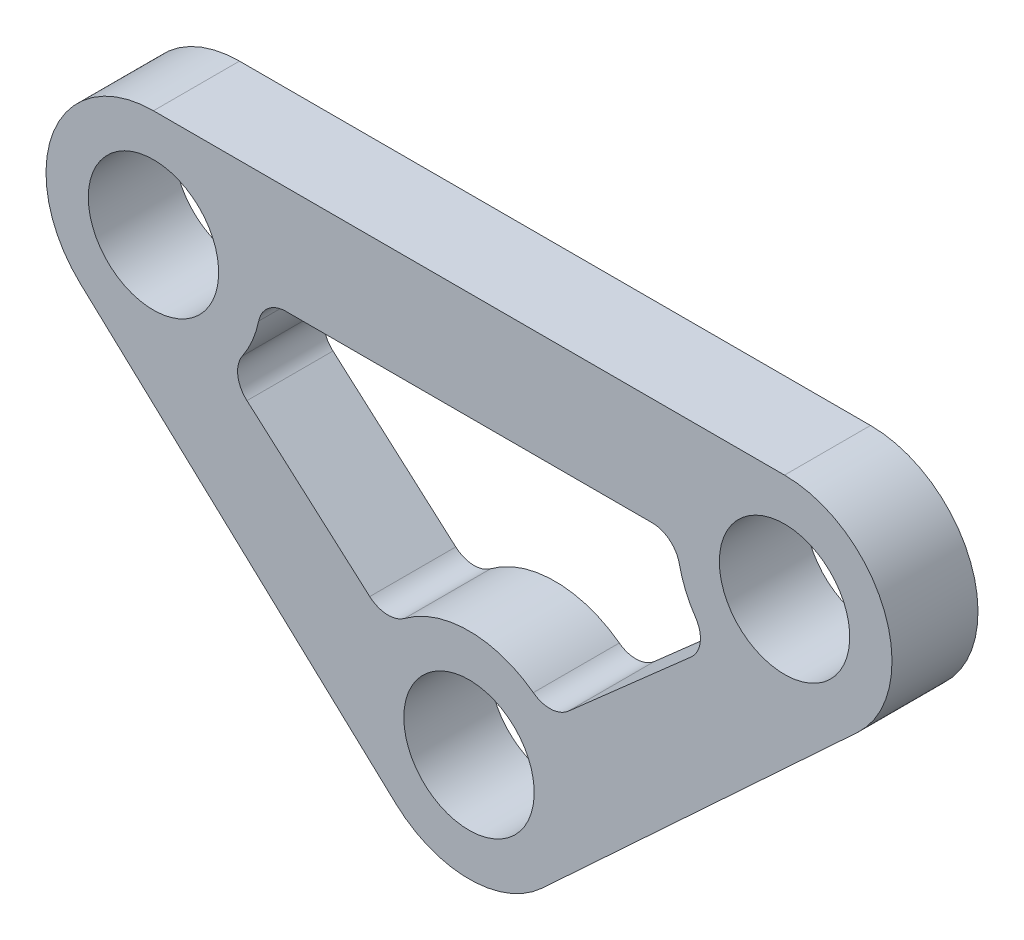
ISO-10303-21;
HEADER;
FILE_DESCRIPTION(('STEP AP214'),'2;1');
FILE_NAME('part.step','',(''),(''),'','','');
FILE_SCHEMA(('AUTOMOTIVE_DESIGN { 1 0 10303 214 1 1 1 1 }'));
ENDSEC;
DATA;
#1=APPLICATION_CONTEXT('core data for automotive mechanical design processes');
#2=APPLICATION_PROTOCOL_DEFINITION('international standard','automotive_design',2000,#1);
#3=PRODUCT_CONTEXT('',#1,'mechanical');
#4=PRODUCT('Part','Part','',(#3));
#5=PRODUCT_RELATED_PRODUCT_CATEGORY('part','',(#4));
#6=PRODUCT_DEFINITION_FORMATION('','',#4);
#7=PRODUCT_DEFINITION_CONTEXT('part definition',#1,'design');
#8=PRODUCT_DEFINITION('design','',#6,#7);
#9=PRODUCT_DEFINITION_SHAPE('','',#8);
#10=(LENGTH_UNIT() NAMED_UNIT(*) SI_UNIT(.MILLI.,.METRE.));
#11=(NAMED_UNIT(*) PLANE_ANGLE_UNIT() SI_UNIT($,.RADIAN.));
#12=(NAMED_UNIT(*) SI_UNIT($,.STERADIAN.) SOLID_ANGLE_UNIT());
#13=UNCERTAINTY_MEASURE_WITH_UNIT(LENGTH_MEASURE(1.E-05),#10,'distance_accuracy_value','');
#14=(GEOMETRIC_REPRESENTATION_CONTEXT(3) GLOBAL_UNCERTAINTY_ASSIGNED_CONTEXT((#13)) GLOBAL_UNIT_ASSIGNED_CONTEXT((#10,
#11,#12)) REPRESENTATION_CONTEXT('',''));
#15=CARTESIAN_POINT('',(0.,0.,0.));
#16=DIRECTION('',(0.,0.,1.));
#17=DIRECTION('',(1.,0.,0.));
#18=AXIS2_PLACEMENT_3D('',#15,#16,#17);
#19=CARTESIAN_POINT('',(-37.1381571139909,26.0584892934717,3.1));
#20=DIRECTION('',(0.,0.,1.));
#21=DIRECTION('',(1.,0.,0.));
#22=AXIS2_PLACEMENT_3D('',#19,#20,#21);
#23=PLANE('',#22);
#24=CARTESIAN_POINT('',(-25.7631571139909,15.5084892934717,3.1));
#25=DIRECTION('',(0.,0.,1.));
#26=DIRECTION('',(-1.,0.,0.));
#27=AXIS2_PLACEMENT_3D('',#24,#25,#26);
#28=CIRCLE('',#27,2.35);
#29=CARTESIAN_POINT('',(-28.1131571139909,15.5084892934717,3.1));
#30=VERTEX_POINT('',#29);
#31=EDGE_CURVE('E249',#30,#30,#28,.T.);
#32=ORIENTED_EDGE('',*,*,#31,.F.);
#33=EDGE_LOOP('',(#32));
#34=FACE_BOUND('',#33,.T.);
#35=CARTESIAN_POINT('',(-14.3881571139909,26.0584892934717,3.1));
#36=DIRECTION('',(0.,0.,1.));
#37=DIRECTION('',(1.,0.,0.));
#38=AXIS2_PLACEMENT_3D('',#35,#36,#37);
#39=CIRCLE('',#38,2.35);
#40=CARTESIAN_POINT('',(-16.7381571139909,26.0584892934717,3.1));
#41=VERTEX_POINT('',#40);
#42=EDGE_CURVE('E261',#41,#41,#39,.T.);
#43=ORIENTED_EDGE('',*,*,#42,.F.);
#44=EDGE_LOOP('',(#43));
#45=FACE_BOUND('',#44,.T.);
#46=CARTESIAN_POINT('',(-37.1381571139909,26.0584892934717,3.1));
#47=DIRECTION('',(0.,0.,1.));
#48=DIRECTION('',(1.,0.,0.));
#49=AXIS2_PLACEMENT_3D('',#46,#47,#48);
#50=CIRCLE('',#49,3.875);
#51=CARTESIAN_POINT('',(-37.1381571139909,29.9334892934717,3.1));
#52=VERTEX_POINT('',#51);
#53=CARTESIAN_POINT('',(-39.7732281276879,23.2173582242013,3.1));
#54=VERTEX_POINT('',#53);
#55=EDGE_CURVE('E267',#52,#54,#50,.T.);
#56=ORIENTED_EDGE('',*,*,#55,.T.);
#57=DIRECTION('',(0.733195114650441,-0.680018326115353,0.));
#58=VECTOR('',#57,1.);
#59=CARTESIAN_POINT('',(-39.7732281276879,23.2173582242013,3.1));
#60=LINE('',#59,#58);
#61=CARTESIAN_POINT('',(-28.3982281276879,12.6673582242013,3.1));
#62=VERTEX_POINT('',#61);
#63=EDGE_CURVE('E270',#54,#62,#60,.T.);
#64=ORIENTED_EDGE('',*,*,#63,.T.);
#65=CARTESIAN_POINT('',(-25.7631571139909,15.5084892934717,3.1));
#66=DIRECTION('',(0.,0.,1.));
#67=DIRECTION('',(1.,0.,0.));
#68=AXIS2_PLACEMENT_3D('',#65,#66,#67);
#69=CIRCLE('',#68,3.875);
#70=CARTESIAN_POINT('',(-23.1280861002939,12.6673582242013,3.1));
#71=VERTEX_POINT('',#70);
#72=EDGE_CURVE('E273',#62,#71,#69,.T.);
#73=ORIENTED_EDGE('',*,*,#72,.T.);
#74=DIRECTION('',(0.733195114650441,0.680018326115353,0.));
#75=VECTOR('',#74,1.);
#76=CARTESIAN_POINT('',(-11.7530861002939,23.2173582242013,3.1));
#77=LINE('',#76,#75);
#78=CARTESIAN_POINT('',(-11.7530861002939,23.2173582242013,3.1));
#79=VERTEX_POINT('',#78);
#80=EDGE_CURVE('E275',#71,#79,#77,.T.);
#81=ORIENTED_EDGE('',*,*,#80,.T.);
#82=CARTESIAN_POINT('',(-14.3881571139909,26.0584892934717,3.1));
#83=DIRECTION('',(0.,0.,1.));
#84=DIRECTION('',(1.,0.,0.));
#85=AXIS2_PLACEMENT_3D('',#82,#83,#84);
#86=CIRCLE('',#85,3.875);
#87=CARTESIAN_POINT('',(-14.3881571139909,29.9334892934717,3.1));
#88=VERTEX_POINT('',#87);
#89=EDGE_CURVE('E277',#79,#88,#86,.T.);
#90=ORIENTED_EDGE('',*,*,#89,.T.);
#91=DIRECTION('',(-1.,0.,0.));
#92=VECTOR('',#91,1.);
#93=CARTESIAN_POINT('',(-37.1381571139909,29.9334892934717,3.1));
#94=LINE('',#93,#92);
#95=EDGE_CURVE('E279',#88,#52,#94,.T.);
#96=ORIENTED_EDGE('',*,*,#95,.T.);
#97=EDGE_LOOP('',(#56,#64,#73,#81,#90,#96));
#98=FACE_BOUND('',#97,.T.);
#99=CARTESIAN_POINT('',(-37.1381571139909,26.0584892934717,3.1));
#100=DIRECTION('',(0.,0.,1.));
#101=DIRECTION('',(-1.,0.,0.));
#102=AXIS2_PLACEMENT_3D('',#99,#100,#101);
#103=CIRCLE('',#102,2.35);
#104=CARTESIAN_POINT('',(-39.4881571139909,26.0584892934717,3.1));
#105=VERTEX_POINT('',#104);
#106=EDGE_CURVE('E255',#105,#105,#103,.T.);
#107=ORIENTED_EDGE('',*,*,#106,.F.);
#108=EDGE_LOOP('',(#107));
#109=FACE_BOUND('',#108,.T.);
#110=DIRECTION('',(0.749958449407783,0.661484938726403,0.));
#111=VECTOR('',#110,1.);
#112=CARTESIAN_POINT('',(-17.7588112080453,22.5685527747492,3.1));
#113=LINE('',#112,#111);
#114=CARTESIAN_POINT('',(-22.184855112482,18.6646546544751,3.1));
#115=VERTEX_POINT('',#114);
#116=CARTESIAN_POINT('',(-17.7588112080453,22.5685527747492,3.1));
#117=VERTEX_POINT('',#116);
#118=EDGE_CURVE('E164',#115,#117,#113,.T.);
#119=ORIENTED_EDGE('',*,*,#118,.F.);
#120=CARTESIAN_POINT('',(-22.8463400512084,19.4146131038829,3.1));
#121=DIRECTION('',(0.,0.,1.));
#122=DIRECTION('',(-1.,0.,0.));
#123=AXIS2_PLACEMENT_3D('',#120,#121,#122);
#124=CIRCLE('',#123,0.999999999999999);
#125=CARTESIAN_POINT('',(-23.4446614999843,18.6133569376447,3.1));
#126=VERTEX_POINT('',#125);
#127=EDGE_CURVE('E156',#126,#115,#124,.T.);
#128=ORIENTED_EDGE('',*,*,#127,.F.);
#129=CARTESIAN_POINT('',(-25.7631571139909,15.5084892934717,3.1));
#130=DIRECTION('',(0.,0.,-1.));
#131=DIRECTION('',(1.,0.,0.));
#132=AXIS2_PLACEMENT_3D('',#129,#130,#131);
#133=CIRCLE('',#132,3.875);
#134=CARTESIAN_POINT('',(-28.0816527279975,18.6133569376447,3.1));
#135=VERTEX_POINT('',#134);
#136=EDGE_CURVE('E197',#135,#126,#133,.T.);
#137=ORIENTED_EDGE('',*,*,#136,.F.);
#138=CARTESIAN_POINT('',(-28.6799741767734,19.4146131038829,3.1));
#139=DIRECTION('',(0.,0.,1.));
#140=DIRECTION('',(-1.,0.,0.));
#141=AXIS2_PLACEMENT_3D('',#138,#139,#140);
#142=CIRCLE('',#141,1.);
#143=CARTESIAN_POINT('',(-29.3414591154998,18.6646546544751,3.1));
#144=VERTEX_POINT('',#143);
#145=EDGE_CURVE('E195',#144,#135,#142,.T.);
#146=ORIENTED_EDGE('',*,*,#145,.F.);
#147=DIRECTION('',(0.749958449407784,-0.661484938726403,0.));
#148=VECTOR('',#147,1.);
#149=CARTESIAN_POINT('',(-33.7675030199365,22.5685527747492,3.1));
#150=LINE('',#149,#148);
#151=CARTESIAN_POINT('',(-33.7675030199365,22.5685527747493,3.1));
#152=VERTEX_POINT('',#151);
#153=EDGE_CURVE('E193',#152,#144,#150,.T.);
#154=ORIENTED_EDGE('',*,*,#153,.F.);
#155=CARTESIAN_POINT('',(-33.1060180812101,23.318511224157,3.1));
#156=DIRECTION('',(0.,0.,1.));
#157=DIRECTION('',(1.,0.,0.));
#158=AXIS2_PLACEMENT_3D('',#155,#156,#157);
#159=CIRCLE('',#158,0.999999999999982);
#160=CARTESIAN_POINT('',(-33.9331235238318,23.8805580076062,3.1));
#161=VERTEX_POINT('',#160);
#162=EDGE_CURVE('E191',#161,#152,#159,.T.);
#163=ORIENTED_EDGE('',*,*,#162,.F.);
#164=CARTESIAN_POINT('',(-37.1381571139909,26.0584892934717,3.1));
#165=DIRECTION('',(0.,0.,-1.));
#166=DIRECTION('',(1.,0.,0.));
#167=AXIS2_PLACEMENT_3D('',#164,#165,#166);
#168=CIRCLE('',#167,3.87500000000001);
#169=CARTESIAN_POINT('',(-33.3455585549924,25.2636174985999,3.1));
#170=VERTEX_POINT('',#169);
#171=EDGE_CURVE('E189',#170,#161,#168,.T.);
#172=ORIENTED_EDGE('',*,*,#171,.F.);
#173=CARTESIAN_POINT('',(-32.3668234429928,25.0584892934717,3.1));
#174=DIRECTION('',(0.,0.,1.));
#175=DIRECTION('',(1.,0.,0.));
#176=AXIS2_PLACEMENT_3D('',#173,#174,#175);
#177=CIRCLE('',#176,1.);
#178=CARTESIAN_POINT('',(-32.3668234429928,26.0584892934717,3.1));
#179=VERTEX_POINT('',#178);
#180=EDGE_CURVE('E187',#179,#170,#177,.T.);
#181=ORIENTED_EDGE('',*,*,#180,.F.);
#182=DIRECTION('',(-1.,0.,0.));
#183=VECTOR('',#182,1.);
#184=CARTESIAN_POINT('',(-32.3668234429928,26.0584892934717,3.1));
#185=LINE('',#184,#183);
#186=CARTESIAN_POINT('',(-19.159490784989,26.0584892934717,3.1));
#187=VERTEX_POINT('',#186);
#188=EDGE_CURVE('E185',#187,#179,#185,.T.);
#189=ORIENTED_EDGE('',*,*,#188,.F.);
#190=CARTESIAN_POINT('',(-19.159490784989,25.0584892934717,3.1));
#191=DIRECTION('',(0.,0.,1.));
#192=DIRECTION('',(-1.,0.,0.));
#193=AXIS2_PLACEMENT_3D('',#190,#191,#192);
#194=CIRCLE('',#193,1.);
#195=CARTESIAN_POINT('',(-18.1807556729894,25.2636174985999,3.1));
#196=VERTEX_POINT('',#195);
#197=EDGE_CURVE('E183',#196,#187,#194,.T.);
#198=ORIENTED_EDGE('',*,*,#197,.F.);
#199=CARTESIAN_POINT('',(-14.3881571139909,26.0584892934717,3.1));
#200=DIRECTION('',(0.,0.,-1.));
#201=DIRECTION('',(-1.,0.,0.));
#202=AXIS2_PLACEMENT_3D('',#199,#200,#201);
#203=CIRCLE('',#202,3.87499999999999);
#204=CARTESIAN_POINT('',(-17.59319070415,23.8805580076062,3.1));
#205=VERTEX_POINT('',#204);
#206=EDGE_CURVE('E179',#205,#196,#203,.T.);
#207=ORIENTED_EDGE('',*,*,#206,.F.);
#208=CARTESIAN_POINT('',(-18.4202961467717,23.318511224157,3.1));
#209=DIRECTION('',(0.,0.,1.));
#210=DIRECTION('',(-1.,0.,0.));
#211=AXIS2_PLACEMENT_3D('',#208,#209,#210);
#212=CIRCLE('',#211,0.999999999999999);
#213=EDGE_CURVE('E177',#117,#205,#212,.T.);
#214=ORIENTED_EDGE('',*,*,#213,.F.);
#215=EDGE_LOOP('',(#119,#128,#137,#146,#154,#163,#172,#181,#189,#198,#207,#214));
#216=FACE_BOUND('',#215,.T.);
#217=ADVANCED_FACE('F31',(#34,#45,#98,#109,#216),#23,.T.);
#218=CARTESIAN_POINT('',(-37.1381571139909,26.0584892934717,0.));
#219=DIRECTION('',(0.,0.,1.));
#220=DIRECTION('',(1.,0.,0.));
#221=AXIS2_PLACEMENT_3D('',#218,#219,#220);
#222=PLANE('',#221);
#223=CARTESIAN_POINT('',(-25.7631571139909,15.5084892934717,0.));
#224=DIRECTION('',(0.,0.,1.));
#225=DIRECTION('',(-1.,0.,0.));
#226=AXIS2_PLACEMENT_3D('',#223,#224,#225);
#227=CIRCLE('',#226,2.35);
#228=CARTESIAN_POINT('',(-28.1131571139909,15.5084892934717,0.));
#229=VERTEX_POINT('',#228);
#230=EDGE_CURVE('E172',#229,#229,#227,.T.);
#231=ORIENTED_EDGE('',*,*,#230,.T.);
#232=EDGE_LOOP('',(#231));
#233=FACE_BOUND('',#232,.T.);
#234=CARTESIAN_POINT('',(-14.3881571139909,26.0584892934717,0.));
#235=DIRECTION('',(0.,0.,1.));
#236=DIRECTION('',(1.,0.,0.));
#237=AXIS2_PLACEMENT_3D('',#234,#235,#236);
#238=CIRCLE('',#237,2.35);
#239=CARTESIAN_POINT('',(-16.7381571139909,26.0584892934717,0.));
#240=VERTEX_POINT('',#239);
#241=EDGE_CURVE('E258',#240,#240,#238,.T.);
#242=ORIENTED_EDGE('',*,*,#241,.T.);
#243=EDGE_LOOP('',(#242));
#244=FACE_BOUND('',#243,.T.);
#245=CARTESIAN_POINT('',(-37.1381571139909,26.0584892934717,0.));
#246=DIRECTION('',(0.,0.,1.));
#247=DIRECTION('',(1.,0.,0.));
#248=AXIS2_PLACEMENT_3D('',#245,#246,#247);
#249=CIRCLE('',#248,3.875);
#250=CARTESIAN_POINT('',(-37.1381571139909,29.9334892934717,0.));
#251=VERTEX_POINT('',#250);
#252=CARTESIAN_POINT('',(-39.7732281276879,23.2173582242013,0.));
#253=VERTEX_POINT('',#252);
#254=EDGE_CURVE('E264',#251,#253,#249,.T.);
#255=ORIENTED_EDGE('',*,*,#254,.F.);
#256=DIRECTION('',(-1.,0.,0.));
#257=VECTOR('',#256,1.);
#258=CARTESIAN_POINT('',(-37.1381571139909,29.9334892934717,0.));
#259=LINE('',#258,#257);
#260=CARTESIAN_POINT('',(-14.3881571139909,29.9334892934717,0.));
#261=VERTEX_POINT('',#260);
#262=EDGE_CURVE('E271',#261,#251,#259,.T.);
#263=ORIENTED_EDGE('',*,*,#262,.F.);
#264=CARTESIAN_POINT('',(-14.3881571139909,26.0584892934717,0.));
#265=DIRECTION('',(0.,0.,1.));
#266=DIRECTION('',(1.,0.,0.));
#267=AXIS2_PLACEMENT_3D('',#264,#265,#266);
#268=CIRCLE('',#267,3.875);
#269=CARTESIAN_POINT('',(-11.7530861002939,23.2173582242013,0.));
#270=VERTEX_POINT('',#269);
#271=EDGE_CURVE('E290',#270,#261,#268,.T.);
#272=ORIENTED_EDGE('',*,*,#271,.F.);
#273=DIRECTION('',(0.733195114650441,0.680018326115353,0.));
#274=VECTOR('',#273,1.);
#275=CARTESIAN_POINT('',(-11.7530861002939,23.2173582242013,0.));
#276=LINE('',#275,#274);
#277=CARTESIAN_POINT('',(-23.1280861002939,12.6673582242013,0.));
#278=VERTEX_POINT('',#277);
#279=EDGE_CURVE('E288',#278,#270,#276,.T.);
#280=ORIENTED_EDGE('',*,*,#279,.F.);
#281=CARTESIAN_POINT('',(-25.7631571139909,15.5084892934717,0.));
#282=DIRECTION('',(0.,0.,1.));
#283=DIRECTION('',(1.,0.,0.));
#284=AXIS2_PLACEMENT_3D('',#281,#282,#283);
#285=CIRCLE('',#284,3.875);
#286=CARTESIAN_POINT('',(-28.3982281276879,12.6673582242013,0.));
#287=VERTEX_POINT('',#286);
#288=EDGE_CURVE('E286',#287,#278,#285,.T.);
#289=ORIENTED_EDGE('',*,*,#288,.F.);
#290=DIRECTION('',(0.733195114650441,-0.680018326115353,0.));
#291=VECTOR('',#290,1.);
#292=CARTESIAN_POINT('',(-39.7732281276879,23.2173582242013,0.));
#293=LINE('',#292,#291);
#294=EDGE_CURVE('E284',#253,#287,#293,.T.);
#295=ORIENTED_EDGE('',*,*,#294,.F.);
#296=EDGE_LOOP('',(#255,#263,#272,#280,#289,#295));
#297=FACE_BOUND('',#296,.T.);
#298=CARTESIAN_POINT('',(-37.1381571139909,26.0584892934717,0.));
#299=DIRECTION('',(0.,0.,1.));
#300=DIRECTION('',(-1.,0.,0.));
#301=AXIS2_PLACEMENT_3D('',#298,#299,#300);
#302=CIRCLE('',#301,2.35);
#303=CARTESIAN_POINT('',(-39.4881571139909,26.0584892934717,0.));
#304=VERTEX_POINT('',#303);
#305=EDGE_CURVE('E252',#304,#304,#302,.T.);
#306=ORIENTED_EDGE('',*,*,#305,.T.);
#307=EDGE_LOOP('',(#306));
#308=FACE_BOUND('',#307,.T.);
#309=CARTESIAN_POINT('',(-22.8463400512084,19.4146131038829,0.));
#310=DIRECTION('',(0.,0.,1.));
#311=DIRECTION('',(-1.,0.,0.));
#312=AXIS2_PLACEMENT_3D('',#309,#310,#311);
#313=CIRCLE('',#312,0.999999999999999);
#314=CARTESIAN_POINT('',(-23.4446614999843,18.6133569376447,0.));
#315=VERTEX_POINT('',#314);
#316=CARTESIAN_POINT('',(-22.184855112482,18.6646546544751,0.));
#317=VERTEX_POINT('',#316);
#318=EDGE_CURVE('E54',#315,#317,#313,.T.);
#319=ORIENTED_EDGE('',*,*,#318,.T.);
#320=DIRECTION('',(0.749958449407783,0.661484938726403,0.));
#321=VECTOR('',#320,1.);
#322=CARTESIAN_POINT('',(-17.7588112080453,22.5685527747492,0.));
#323=LINE('',#322,#321);
#324=CARTESIAN_POINT('',(-17.7588112080453,22.5685527747492,0.));
#325=VERTEX_POINT('',#324);
#326=EDGE_CURVE('E171',#317,#325,#323,.T.);
#327=ORIENTED_EDGE('',*,*,#326,.T.);
#328=CARTESIAN_POINT('',(-18.4202961467717,23.318511224157,0.));
#329=DIRECTION('',(0.,0.,1.));
#330=DIRECTION('',(-1.,0.,0.));
#331=AXIS2_PLACEMENT_3D('',#328,#329,#330);
#332=CIRCLE('',#331,0.999999999999999);
#333=CARTESIAN_POINT('',(-17.59319070415,23.8805580076062,0.));
#334=VERTEX_POINT('',#333);
#335=EDGE_CURVE('E201',#325,#334,#332,.T.);
#336=ORIENTED_EDGE('',*,*,#335,.T.);
#337=CARTESIAN_POINT('',(-14.3881571139909,26.0584892934717,0.));
#338=DIRECTION('',(0.,0.,-1.));
#339=DIRECTION('',(-1.,0.,0.));
#340=AXIS2_PLACEMENT_3D('',#337,#338,#339);
#341=CIRCLE('',#340,3.87499999999999);
#342=CARTESIAN_POINT('',(-18.1807556729894,25.2636174985999,0.));
#343=VERTEX_POINT('',#342);
#344=EDGE_CURVE('E204',#334,#343,#341,.T.);
#345=ORIENTED_EDGE('',*,*,#344,.T.);
#346=CARTESIAN_POINT('',(-19.159490784989,25.0584892934717,0.));
#347=DIRECTION('',(0.,0.,1.));
#348=DIRECTION('',(-1.,0.,0.));
#349=AXIS2_PLACEMENT_3D('',#346,#347,#348);
#350=CIRCLE('',#349,1.);
#351=CARTESIAN_POINT('',(-19.159490784989,26.0584892934717,0.));
#352=VERTEX_POINT('',#351);
#353=EDGE_CURVE('E207',#343,#352,#350,.T.);
#354=ORIENTED_EDGE('',*,*,#353,.T.);
#355=DIRECTION('',(-1.,0.,0.));
#356=VECTOR('',#355,1.);
#357=CARTESIAN_POINT('',(-32.3668234429928,26.0584892934717,0.));
#358=LINE('',#357,#356);
#359=CARTESIAN_POINT('',(-32.3668234429928,26.0584892934717,0.));
#360=VERTEX_POINT('',#359);
#361=EDGE_CURVE('E210',#352,#360,#358,.T.);
#362=ORIENTED_EDGE('',*,*,#361,.T.);
#363=CARTESIAN_POINT('',(-32.3668234429928,25.0584892934717,0.));
#364=DIRECTION('',(0.,0.,1.));
#365=DIRECTION('',(1.,0.,0.));
#366=AXIS2_PLACEMENT_3D('',#363,#364,#365);
#367=CIRCLE('',#366,1.);
#368=CARTESIAN_POINT('',(-33.3455585549924,25.2636174985999,0.));
#369=VERTEX_POINT('',#368);
#370=EDGE_CURVE('E213',#360,#369,#367,.T.);
#371=ORIENTED_EDGE('',*,*,#370,.T.);
#372=CARTESIAN_POINT('',(-37.1381571139909,26.0584892934717,0.));
#373=DIRECTION('',(0.,0.,-1.));
#374=DIRECTION('',(1.,0.,0.));
#375=AXIS2_PLACEMENT_3D('',#372,#373,#374);
#376=CIRCLE('',#375,3.87500000000001);
#377=CARTESIAN_POINT('',(-33.9331235238318,23.8805580076062,0.));
#378=VERTEX_POINT('',#377);
#379=EDGE_CURVE('E216',#369,#378,#376,.T.);
#380=ORIENTED_EDGE('',*,*,#379,.T.);
#381=CARTESIAN_POINT('',(-33.1060180812101,23.318511224157,0.));
#382=DIRECTION('',(0.,0.,1.));
#383=DIRECTION('',(1.,0.,0.));
#384=AXIS2_PLACEMENT_3D('',#381,#382,#383);
#385=CIRCLE('',#384,0.999999999999982);
#386=CARTESIAN_POINT('',(-33.7675030199365,22.5685527747493,0.));
#387=VERTEX_POINT('',#386);
#388=EDGE_CURVE('E219',#378,#387,#385,.T.);
#389=ORIENTED_EDGE('',*,*,#388,.T.);
#390=DIRECTION('',(0.749958449407784,-0.661484938726403,0.));
#391=VECTOR('',#390,1.);
#392=CARTESIAN_POINT('',(-33.7675030199365,22.5685527747492,0.));
#393=LINE('',#392,#391);
#394=CARTESIAN_POINT('',(-29.3414591154998,18.6646546544751,0.));
#395=VERTEX_POINT('',#394);
#396=EDGE_CURVE('E222',#387,#395,#393,.T.);
#397=ORIENTED_EDGE('',*,*,#396,.T.);
#398=CARTESIAN_POINT('',(-28.6799741767734,19.4146131038829,0.));
#399=DIRECTION('',(0.,0.,1.));
#400=DIRECTION('',(-1.,0.,0.));
#401=AXIS2_PLACEMENT_3D('',#398,#399,#400);
#402=CIRCLE('',#401,1.);
#403=CARTESIAN_POINT('',(-28.0816527279975,18.6133569376447,0.));
#404=VERTEX_POINT('',#403);
#405=EDGE_CURVE('E225',#395,#404,#402,.T.);
#406=ORIENTED_EDGE('',*,*,#405,.T.);
#407=CARTESIAN_POINT('',(-25.7631571139909,15.5084892934717,0.));
#408=DIRECTION('',(0.,0.,-1.));
#409=DIRECTION('',(1.,0.,0.));
#410=AXIS2_PLACEMENT_3D('',#407,#408,#409);
#411=CIRCLE('',#410,3.875);
#412=EDGE_CURVE('E165',#404,#315,#411,.T.);
#413=ORIENTED_EDGE('',*,*,#412,.T.);
#414=EDGE_LOOP('',(#319,#327,#336,#345,#354,#362,#371,#380,#389,#397,#406,#413));
#415=FACE_BOUND('',#414,.T.);
#416=ADVANCED_FACE('F314',(#233,#244,#297,#308,#415),#222,.F.);
#417=CARTESIAN_POINT('',(-37.1381571139909,26.0584892934717,3.1));
#418=DIRECTION('',(0.,0.,-1.));
#419=DIRECTION('',(-1.,0.,0.));
#420=AXIS2_PLACEMENT_3D('',#417,#418,#419);
#421=CYLINDRICAL_SURFACE('',#420,3.875);
#422=ORIENTED_EDGE('',*,*,#254,.T.);
#423=DIRECTION('',(0.,0.,-1.));
#424=VECTOR('',#423,1.);
#425=CARTESIAN_POINT('',(-39.7732281276879,23.2173582242013,3.1));
#426=LINE('',#425,#424);
#427=EDGE_CURVE('E11',#54,#253,#426,.T.);
#428=ORIENTED_EDGE('',*,*,#427,.F.);
#429=ORIENTED_EDGE('',*,*,#55,.F.);
#430=DIRECTION('',(0.,0.,-1.));
#431=VECTOR('',#430,1.);
#432=CARTESIAN_POINT('',(-37.1381571139909,29.9334892934717,3.1));
#433=LINE('',#432,#431);
#434=EDGE_CURVE('E281',#52,#251,#433,.T.);
#435=ORIENTED_EDGE('',*,*,#434,.T.);
#436=EDGE_LOOP('',(#422,#428,#429,#435));
#437=FACE_BOUND('',#436,.T.);
#438=ADVANCED_FACE('F33',(#437),#421,.T.);
#439=CARTESIAN_POINT('',(-39.7732281276879,23.2173582242013,3.1));
#440=DIRECTION('',(0.680018326115353,0.733195114650441,0.));
#441=DIRECTION('',(-0.733195114650441,0.680018326115354,0.));
#442=AXIS2_PLACEMENT_3D('',#439,#440,#441);
#443=PLANE('',#442);
#444=ORIENTED_EDGE('',*,*,#294,.T.);
#445=DIRECTION('',(0.,0.,-1.));
#446=VECTOR('',#445,1.);
#447=CARTESIAN_POINT('',(-28.3982281276879,12.6673582242013,3.1));
#448=LINE('',#447,#446);
#449=EDGE_CURVE('E39',#62,#287,#448,.T.);
#450=ORIENTED_EDGE('',*,*,#449,.F.);
#451=ORIENTED_EDGE('',*,*,#63,.F.);
#452=ORIENTED_EDGE('',*,*,#427,.T.);
#453=EDGE_LOOP('',(#444,#450,#451,#452));
#454=FACE_BOUND('',#453,.T.);
#455=ADVANCED_FACE('F332',(#454),#443,.F.);
#456=CARTESIAN_POINT('',(-25.7631571139909,15.5084892934717,3.1));
#457=DIRECTION('',(0.,0.,-1.));
#458=DIRECTION('',(-1.,0.,0.));
#459=AXIS2_PLACEMENT_3D('',#456,#457,#458);
#460=CYLINDRICAL_SURFACE('',#459,3.875);
#461=ORIENTED_EDGE('',*,*,#288,.T.);
#462=DIRECTION('',(0.,0.,-1.));
#463=VECTOR('',#462,1.);
#464=CARTESIAN_POINT('',(-23.1280861002939,12.6673582242013,3.1));
#465=LINE('',#464,#463);
#466=EDGE_CURVE('E301',#71,#278,#465,.T.);
#467=ORIENTED_EDGE('',*,*,#466,.F.);
#468=ORIENTED_EDGE('',*,*,#72,.F.);
#469=ORIENTED_EDGE('',*,*,#449,.T.);
#470=EDGE_LOOP('',(#461,#467,#468,#469));
#471=FACE_BOUND('',#470,.T.);
#472=ADVANCED_FACE('F308',(#471),#460,.T.);
#473=CARTESIAN_POINT('',(-11.7530861002939,23.2173582242013,3.1));
#474=DIRECTION('',(-0.680018326115353,0.733195114650441,0.));
#475=DIRECTION('',(-0.733195114650441,-0.680018326115354,0.));
#476=AXIS2_PLACEMENT_3D('',#473,#474,#475);
#477=PLANE('',#476);
#478=ORIENTED_EDGE('',*,*,#279,.T.);
#479=DIRECTION('',(0.,0.,-1.));
#480=VECTOR('',#479,1.);
#481=CARTESIAN_POINT('',(-11.7530861002939,23.2173582242013,3.1));
#482=LINE('',#481,#480);
#483=EDGE_CURVE('E298',#79,#270,#482,.T.);
#484=ORIENTED_EDGE('',*,*,#483,.F.);
#485=ORIENTED_EDGE('',*,*,#80,.F.);
#486=ORIENTED_EDGE('',*,*,#466,.T.);
#487=EDGE_LOOP('',(#478,#484,#485,#486));
#488=FACE_BOUND('',#487,.T.);
#489=ADVANCED_FACE('F320',(#488),#477,.F.);
#490=CARTESIAN_POINT('',(-14.3881571139909,26.0584892934717,3.1));
#491=DIRECTION('',(0.,0.,-1.));
#492=DIRECTION('',(-1.,0.,0.));
#493=AXIS2_PLACEMENT_3D('',#490,#491,#492);
#494=CYLINDRICAL_SURFACE('',#493,3.875);
#495=ORIENTED_EDGE('',*,*,#271,.T.);
#496=DIRECTION('',(0.,0.,-1.));
#497=VECTOR('',#496,1.);
#498=CARTESIAN_POINT('',(-14.3881571139909,29.9334892934717,3.1));
#499=LINE('',#498,#497);
#500=EDGE_CURVE('E295',#88,#261,#499,.T.);
#501=ORIENTED_EDGE('',*,*,#500,.F.);
#502=ORIENTED_EDGE('',*,*,#89,.F.);
#503=ORIENTED_EDGE('',*,*,#483,.T.);
#504=EDGE_LOOP('',(#495,#501,#502,#503));
#505=FACE_BOUND('',#504,.T.);
#506=ADVANCED_FACE('F324',(#505),#494,.T.);
#507=CARTESIAN_POINT('',(-37.1381571139909,29.9334892934717,3.1));
#508=DIRECTION('',(0.,-1.,0.));
#509=DIRECTION('',(0.,0.,-1.));
#510=AXIS2_PLACEMENT_3D('',#507,#508,#509);
#511=PLANE('',#510);
#512=ORIENTED_EDGE('',*,*,#262,.T.);
#513=ORIENTED_EDGE('',*,*,#434,.F.);
#514=ORIENTED_EDGE('',*,*,#95,.F.);
#515=ORIENTED_EDGE('',*,*,#500,.T.);
#516=EDGE_LOOP('',(#512,#513,#514,#515));
#517=FACE_BOUND('',#516,.T.);
#518=ADVANCED_FACE('F335',(#517),#511,.F.);
#519=CARTESIAN_POINT('',(-14.3881571139909,26.0584892934717,3.1));
#520=DIRECTION('',(0.,0.,-1.));
#521=DIRECTION('',(-1.,0.,0.));
#522=AXIS2_PLACEMENT_3D('',#519,#520,#521);
#523=CYLINDRICAL_SURFACE('',#522,2.35);
#524=CARTESIAN_POINT('',(-16.7381571139909,26.0584892934717,3.1));
#525=CARTESIAN_POINT('',(-16.7381571139909,26.0584892934717,3.06770833333333));
#526=CARTESIAN_POINT('',(-16.7381571139909,26.0584892934717,3.03541666666667));
#527=CARTESIAN_POINT('',(-16.7381571139909,26.0584892934717,2.97083333333333));
#528=CARTESIAN_POINT('',(-16.7381571139909,26.0584892934717,2.93854166666667));
#529=CARTESIAN_POINT('',(-16.7381571139909,26.0584892934717,2.87395833333333));
#530=CARTESIAN_POINT('',(-16.7381571139909,26.0584892934717,2.84166666666667));
#531=CARTESIAN_POINT('',(-16.7381571139909,26.0584892934717,2.77708333333333));
#532=CARTESIAN_POINT('',(-16.7381571139909,26.0584892934717,2.74479166666667));
#533=CARTESIAN_POINT('',(-16.7381571139909,26.0584892934717,2.68020833333333));
#534=CARTESIAN_POINT('',(-16.7381571139909,26.0584892934717,2.64791666666667));
#535=CARTESIAN_POINT('',(-16.7381571139909,26.0584892934717,2.58333333333333));
#536=CARTESIAN_POINT('',(-16.7381571139909,26.0584892934717,2.55104166666667));
#537=CARTESIAN_POINT('',(-16.7381571139909,26.0584892934717,2.48645833333333));
#538=CARTESIAN_POINT('',(-16.7381571139909,26.0584892934717,2.45416666666667));
#539=CARTESIAN_POINT('',(-16.7381571139909,26.0584892934717,2.38958333333333));
#540=CARTESIAN_POINT('',(-16.7381571139909,26.0584892934717,2.35729166666667));
#541=CARTESIAN_POINT('',(-16.7381571139909,26.0584892934717,2.29270833333333));
#542=CARTESIAN_POINT('',(-16.7381571139909,26.0584892934717,2.26041666666667));
#543=CARTESIAN_POINT('',(-16.7381571139909,26.0584892934717,2.19583333333333));
#544=CARTESIAN_POINT('',(-16.7381571139909,26.0584892934717,2.16354166666667));
#545=CARTESIAN_POINT('',(-16.7381571139909,26.0584892934717,2.09895833333333));
#546=CARTESIAN_POINT('',(-16.7381571139909,26.0584892934717,2.06666666666667));
#547=CARTESIAN_POINT('',(-16.7381571139909,26.0584892934717,2.00208333333333));
#548=CARTESIAN_POINT('',(-16.7381571139909,26.0584892934717,1.96979166666667));
#549=CARTESIAN_POINT('',(-16.7381571139909,26.0584892934717,1.90520833333333));
#550=CARTESIAN_POINT('',(-16.7381571139909,26.0584892934717,1.87291666666667));
#551=CARTESIAN_POINT('',(-16.7381571139909,26.0584892934717,1.80833333333333));
#552=CARTESIAN_POINT('',(-16.7381571139909,26.0584892934717,1.77604166666667));
#553=CARTESIAN_POINT('',(-16.7381571139909,26.0584892934717,1.71145833333333));
#554=CARTESIAN_POINT('',(-16.7381571139909,26.0584892934717,1.67916666666667));
#555=CARTESIAN_POINT('',(-16.7381571139909,26.0584892934717,1.61458333333333));
#556=CARTESIAN_POINT('',(-16.7381571139909,26.0584892934717,1.58229166666667));
#557=CARTESIAN_POINT('',(-16.7381571139909,26.0584892934717,1.51770833333333));
#558=CARTESIAN_POINT('',(-16.7381571139909,26.0584892934717,1.48541666666667));
#559=CARTESIAN_POINT('',(-16.7381571139909,26.0584892934717,1.42083333333333));
#560=CARTESIAN_POINT('',(-16.7381571139909,26.0584892934717,1.38854166666667));
#561=CARTESIAN_POINT('',(-16.7381571139909,26.0584892934717,1.32395833333333));
#562=CARTESIAN_POINT('',(-16.7381571139909,26.0584892934717,1.29166666666667));
#563=CARTESIAN_POINT('',(-16.7381571139909,26.0584892934717,1.22708333333333));
#564=CARTESIAN_POINT('',(-16.7381571139909,26.0584892934717,1.19479166666667));
#565=CARTESIAN_POINT('',(-16.7381571139909,26.0584892934717,1.13020833333333));
#566=CARTESIAN_POINT('',(-16.7381571139909,26.0584892934717,1.09791666666667));
#567=CARTESIAN_POINT('',(-16.7381571139909,26.0584892934717,1.03333333333333));
#568=CARTESIAN_POINT('',(-16.7381571139909,26.0584892934717,1.00104166666667));
#569=CARTESIAN_POINT('',(-16.7381571139909,26.0584892934717,0.936458333333333));
#570=CARTESIAN_POINT('',(-16.7381571139909,26.0584892934717,0.904166666666667));
#571=CARTESIAN_POINT('',(-16.7381571139909,26.0584892934717,0.839583333333334));
#572=CARTESIAN_POINT('',(-16.7381571139909,26.0584892934717,0.807291666666667));
#573=CARTESIAN_POINT('',(-16.7381571139909,26.0584892934717,0.742708333333333));
#574=CARTESIAN_POINT('',(-16.7381571139909,26.0584892934717,0.710416666666667));
#575=CARTESIAN_POINT('',(-16.7381571139909,26.0584892934717,0.645833333333333));
#576=CARTESIAN_POINT('',(-16.7381571139909,26.0584892934717,0.613541666666667));
#577=CARTESIAN_POINT('',(-16.7381571139909,26.0584892934717,0.548958333333333));
#578=CARTESIAN_POINT('',(-16.7381571139909,26.0584892934717,0.516666666666667));
#579=CARTESIAN_POINT('',(-16.7381571139909,26.0584892934717,0.452083333333333));
#580=CARTESIAN_POINT('',(-16.7381571139909,26.0584892934717,0.419791666666667));
#581=CARTESIAN_POINT('',(-16.7381571139909,26.0584892934717,0.355208333333333));
#582=CARTESIAN_POINT('',(-16.7381571139909,26.0584892934717,0.322916666666667));
#583=CARTESIAN_POINT('',(-16.7381571139909,26.0584892934717,0.258333333333333));
#584=CARTESIAN_POINT('',(-16.7381571139909,26.0584892934717,0.226041666666667));
#585=CARTESIAN_POINT('',(-16.7381571139909,26.0584892934717,0.161458333333333));
#586=CARTESIAN_POINT('',(-16.7381571139909,26.0584892934717,0.129166666666667));
#587=CARTESIAN_POINT('',(-16.7381571139909,26.0584892934717,0.0645833333333335));
#588=CARTESIAN_POINT('',(-16.7381571139909,26.0584892934717,0.0322916666666667));
#589=CARTESIAN_POINT('',(-16.7381571139909,26.0584892934717,0.));
#590=B_SPLINE_CURVE_WITH_KNOTS('',3,(#524,#525,#526,#527,#528,#529,#530,#531,#532,#533,#534,
#535,#536,#537,#538,#539,#540,#541,#542,#543,#544,#545,#546,#547,#548,#549,#550,#551,#552,#553,
#554,#555,#556,#557,#558,#559,#560,#561,#562,#563,#564,#565,#566,#567,#568,#569,#570,#571,#572,
#573,#574,#575,#576,#577,#578,#579,#580,#581,#582,#583,#584,#585,#586,#587,#588,#589),
.UNSPECIFIED.,.F.,.F.,(4,2,2,2,2,2,2,2,2,2,2,2,2,2,2,2,2,2,2,2,2,2,2,2,2,2,2,2,2,2,2,2,4),(0.,
0.0968750000000002,0.19375,0.290625,0.3875,0.484375,0.58125,0.678125,0.775,0.871875,0.96875,
1.065625,1.1625,1.259375,1.35625,1.453125,1.55,1.646875,1.74375,1.840625,1.9375,2.034375,
2.13125,2.228125,2.325,2.421875,2.51875,2.615625,2.7125,2.809375,2.90625,3.003125,3.1),.UNSPECIFIED.);
#591=EDGE_CURVE('BSEAM337',#41,#240,#590,.T.);
#592=ORIENTED_EDGE('',*,*,#42,.T.);
#593=ORIENTED_EDGE('',*,*,#241,.F.);
#594=ORIENTED_EDGE('',*,*,#591,.T.);
#595=ORIENTED_EDGE('',*,*,#591,.F.);
#596=EDGE_LOOP('',(#592,#594,#593,#595));
#597=FACE_BOUND('',#596,.T.);
#598=ADVANCED_FACE('F337',(#597),#523,.F.);
#599=CARTESIAN_POINT('',(-37.1381571139909,26.0584892934717,3.1));
#600=DIRECTION('',(0.,0.,-1.));
#601=DIRECTION('',(-1.,0.,0.));
#602=AXIS2_PLACEMENT_3D('',#599,#600,#601);
#603=CYLINDRICAL_SURFACE('',#602,2.35);
#604=CARTESIAN_POINT('',(-39.4881571139909,26.0584892934717,3.1));
#605=CARTESIAN_POINT('',(-39.4881571139909,26.0584892934717,3.06770833333333));
#606=CARTESIAN_POINT('',(-39.4881571139909,26.0584892934717,3.03541666666667));
#607=CARTESIAN_POINT('',(-39.4881571139909,26.0584892934717,2.97083333333333));
#608=CARTESIAN_POINT('',(-39.4881571139909,26.0584892934717,2.93854166666667));
#609=CARTESIAN_POINT('',(-39.4881571139909,26.0584892934717,2.87395833333333));
#610=CARTESIAN_POINT('',(-39.4881571139909,26.0584892934717,2.84166666666667));
#611=CARTESIAN_POINT('',(-39.4881571139909,26.0584892934717,2.77708333333333));
#612=CARTESIAN_POINT('',(-39.4881571139909,26.0584892934717,2.74479166666667));
#613=CARTESIAN_POINT('',(-39.4881571139909,26.0584892934717,2.68020833333333));
#614=CARTESIAN_POINT('',(-39.4881571139909,26.0584892934717,2.64791666666667));
#615=CARTESIAN_POINT('',(-39.4881571139909,26.0584892934717,2.58333333333333));
#616=CARTESIAN_POINT('',(-39.4881571139909,26.0584892934717,2.55104166666667));
#617=CARTESIAN_POINT('',(-39.4881571139909,26.0584892934717,2.48645833333333));
#618=CARTESIAN_POINT('',(-39.4881571139909,26.0584892934717,2.45416666666667));
#619=CARTESIAN_POINT('',(-39.4881571139909,26.0584892934717,2.38958333333333));
#620=CARTESIAN_POINT('',(-39.4881571139909,26.0584892934717,2.35729166666667));
#621=CARTESIAN_POINT('',(-39.4881571139909,26.0584892934717,2.29270833333333));
#622=CARTESIAN_POINT('',(-39.4881571139909,26.0584892934717,2.26041666666667));
#623=CARTESIAN_POINT('',(-39.4881571139909,26.0584892934717,2.19583333333333));
#624=CARTESIAN_POINT('',(-39.4881571139909,26.0584892934717,2.16354166666667));
#625=CARTESIAN_POINT('',(-39.4881571139909,26.0584892934717,2.09895833333333));
#626=CARTESIAN_POINT('',(-39.4881571139909,26.0584892934717,2.06666666666667));
#627=CARTESIAN_POINT('',(-39.4881571139909,26.0584892934717,2.00208333333333));
#628=CARTESIAN_POINT('',(-39.4881571139909,26.0584892934717,1.96979166666667));
#629=CARTESIAN_POINT('',(-39.4881571139909,26.0584892934717,1.90520833333333));
#630=CARTESIAN_POINT('',(-39.4881571139909,26.0584892934717,1.87291666666667));
#631=CARTESIAN_POINT('',(-39.4881571139909,26.0584892934717,1.80833333333333));
#632=CARTESIAN_POINT('',(-39.4881571139909,26.0584892934717,1.77604166666667));
#633=CARTESIAN_POINT('',(-39.4881571139909,26.0584892934717,1.71145833333333));
#634=CARTESIAN_POINT('',(-39.4881571139909,26.0584892934717,1.67916666666667));
#635=CARTESIAN_POINT('',(-39.4881571139909,26.0584892934717,1.61458333333333));
#636=CARTESIAN_POINT('',(-39.4881571139909,26.0584892934717,1.58229166666667));
#637=CARTESIAN_POINT('',(-39.4881571139909,26.0584892934717,1.51770833333333));
#638=CARTESIAN_POINT('',(-39.4881571139909,26.0584892934717,1.48541666666667));
#639=CARTESIAN_POINT('',(-39.4881571139909,26.0584892934717,1.42083333333333));
#640=CARTESIAN_POINT('',(-39.4881571139909,26.0584892934717,1.38854166666667));
#641=CARTESIAN_POINT('',(-39.4881571139909,26.0584892934717,1.32395833333333));
#642=CARTESIAN_POINT('',(-39.4881571139909,26.0584892934717,1.29166666666667));
#643=CARTESIAN_POINT('',(-39.4881571139909,26.0584892934717,1.22708333333333));
#644=CARTESIAN_POINT('',(-39.4881571139909,26.0584892934717,1.19479166666667));
#645=CARTESIAN_POINT('',(-39.4881571139909,26.0584892934717,1.13020833333333));
#646=CARTESIAN_POINT('',(-39.4881571139909,26.0584892934717,1.09791666666667));
#647=CARTESIAN_POINT('',(-39.4881571139909,26.0584892934717,1.03333333333333));
#648=CARTESIAN_POINT('',(-39.4881571139909,26.0584892934717,1.00104166666667));
#649=CARTESIAN_POINT('',(-39.4881571139909,26.0584892934717,0.936458333333333));
#650=CARTESIAN_POINT('',(-39.4881571139909,26.0584892934717,0.904166666666667));
#651=CARTESIAN_POINT('',(-39.4881571139909,26.0584892934717,0.839583333333334));
#652=CARTESIAN_POINT('',(-39.4881571139909,26.0584892934717,0.807291666666667));
#653=CARTESIAN_POINT('',(-39.4881571139909,26.0584892934717,0.742708333333333));
#654=CARTESIAN_POINT('',(-39.4881571139909,26.0584892934717,0.710416666666667));
#655=CARTESIAN_POINT('',(-39.4881571139909,26.0584892934717,0.645833333333333));
#656=CARTESIAN_POINT('',(-39.4881571139909,26.0584892934717,0.613541666666667));
#657=CARTESIAN_POINT('',(-39.4881571139909,26.0584892934717,0.548958333333333));
#658=CARTESIAN_POINT('',(-39.4881571139909,26.0584892934717,0.516666666666667));
#659=CARTESIAN_POINT('',(-39.4881571139909,26.0584892934717,0.452083333333333));
#660=CARTESIAN_POINT('',(-39.4881571139909,26.0584892934717,0.419791666666667));
#661=CARTESIAN_POINT('',(-39.4881571139909,26.0584892934717,0.355208333333333));
#662=CARTESIAN_POINT('',(-39.4881571139909,26.0584892934717,0.322916666666667));
#663=CARTESIAN_POINT('',(-39.4881571139909,26.0584892934717,0.258333333333333));
#664=CARTESIAN_POINT('',(-39.4881571139909,26.0584892934717,0.226041666666667));
#665=CARTESIAN_POINT('',(-39.4881571139909,26.0584892934717,0.161458333333333));
#666=CARTESIAN_POINT('',(-39.4881571139909,26.0584892934717,0.129166666666667));
#667=CARTESIAN_POINT('',(-39.4881571139909,26.0584892934717,0.0645833333333335));
#668=CARTESIAN_POINT('',(-39.4881571139909,26.0584892934717,0.0322916666666667));
#669=CARTESIAN_POINT('',(-39.4881571139909,26.0584892934717,0.));
#670=B_SPLINE_CURVE_WITH_KNOTS('',3,(#604,#605,#606,#607,#608,#609,#610,#611,#612,#613,#614,
#615,#616,#617,#618,#619,#620,#621,#622,#623,#624,#625,#626,#627,#628,#629,#630,#631,#632,#633,
#634,#635,#636,#637,#638,#639,#640,#641,#642,#643,#644,#645,#646,#647,#648,#649,#650,#651,#652,
#653,#654,#655,#656,#657,#658,#659,#660,#661,#662,#663,#664,#665,#666,#667,#668,#669),
.UNSPECIFIED.,.F.,.F.,(4,2,2,2,2,2,2,2,2,2,2,2,2,2,2,2,2,2,2,2,2,2,2,2,2,2,2,2,2,2,2,2,4),(0.,
0.0968750000000002,0.19375,0.290625,0.3875,0.484375,0.58125,0.678125,0.775,0.871875,0.96875,
1.065625,1.1625,1.259375,1.35625,1.453125,1.55,1.646875,1.74375,1.840625,1.9375,2.034375,
2.13125,2.228125,2.325,2.421875,2.51875,2.615625,2.7125,2.809375,2.90625,3.003125,3.1),.UNSPECIFIED.);
#671=EDGE_CURVE('BSEAM343',#105,#304,#670,.T.);
#672=ORIENTED_EDGE('',*,*,#106,.T.);
#673=ORIENTED_EDGE('',*,*,#305,.F.);
#674=ORIENTED_EDGE('',*,*,#671,.T.);
#675=ORIENTED_EDGE('',*,*,#671,.F.);
#676=EDGE_LOOP('',(#672,#674,#673,#675));
#677=FACE_BOUND('',#676,.T.);
#678=ADVANCED_FACE('F343',(#677),#603,.F.);
#679=CARTESIAN_POINT('',(-25.7631571139909,15.5084892934717,3.1));
#680=DIRECTION('',(0.,0.,-1.));
#681=DIRECTION('',(-1.,0.,0.));
#682=AXIS2_PLACEMENT_3D('',#679,#680,#681);
#683=CYLINDRICAL_SURFACE('',#682,2.35);
#684=CARTESIAN_POINT('',(-28.1131571139909,15.5084892934717,3.1));
#685=CARTESIAN_POINT('',(-28.1131571139909,15.5084892934717,3.06770833333333));
#686=CARTESIAN_POINT('',(-28.1131571139909,15.5084892934717,3.03541666666667));
#687=CARTESIAN_POINT('',(-28.1131571139909,15.5084892934717,2.97083333333333));
#688=CARTESIAN_POINT('',(-28.1131571139909,15.5084892934717,2.93854166666667));
#689=CARTESIAN_POINT('',(-28.1131571139909,15.5084892934717,2.87395833333333));
#690=CARTESIAN_POINT('',(-28.1131571139909,15.5084892934717,2.84166666666667));
#691=CARTESIAN_POINT('',(-28.1131571139909,15.5084892934717,2.77708333333333));
#692=CARTESIAN_POINT('',(-28.1131571139909,15.5084892934717,2.74479166666667));
#693=CARTESIAN_POINT('',(-28.1131571139909,15.5084892934717,2.68020833333333));
#694=CARTESIAN_POINT('',(-28.1131571139909,15.5084892934717,2.64791666666667));
#695=CARTESIAN_POINT('',(-28.1131571139909,15.5084892934717,2.58333333333333));
#696=CARTESIAN_POINT('',(-28.1131571139909,15.5084892934717,2.55104166666667));
#697=CARTESIAN_POINT('',(-28.1131571139909,15.5084892934717,2.48645833333333));
#698=CARTESIAN_POINT('',(-28.1131571139909,15.5084892934717,2.45416666666667));
#699=CARTESIAN_POINT('',(-28.1131571139909,15.5084892934717,2.38958333333333));
#700=CARTESIAN_POINT('',(-28.1131571139909,15.5084892934717,2.35729166666667));
#701=CARTESIAN_POINT('',(-28.1131571139909,15.5084892934717,2.29270833333333));
#702=CARTESIAN_POINT('',(-28.1131571139909,15.5084892934717,2.26041666666667));
#703=CARTESIAN_POINT('',(-28.1131571139909,15.5084892934717,2.19583333333333));
#704=CARTESIAN_POINT('',(-28.1131571139909,15.5084892934717,2.16354166666667));
#705=CARTESIAN_POINT('',(-28.1131571139909,15.5084892934717,2.09895833333333));
#706=CARTESIAN_POINT('',(-28.1131571139909,15.5084892934717,2.06666666666667));
#707=CARTESIAN_POINT('',(-28.1131571139909,15.5084892934717,2.00208333333333));
#708=CARTESIAN_POINT('',(-28.1131571139909,15.5084892934717,1.96979166666667));
#709=CARTESIAN_POINT('',(-28.1131571139909,15.5084892934717,1.90520833333333));
#710=CARTESIAN_POINT('',(-28.1131571139909,15.5084892934717,1.87291666666667));
#711=CARTESIAN_POINT('',(-28.1131571139909,15.5084892934717,1.80833333333333));
#712=CARTESIAN_POINT('',(-28.1131571139909,15.5084892934717,1.77604166666667));
#713=CARTESIAN_POINT('',(-28.1131571139909,15.5084892934717,1.71145833333333));
#714=CARTESIAN_POINT('',(-28.1131571139909,15.5084892934717,1.67916666666667));
#715=CARTESIAN_POINT('',(-28.1131571139909,15.5084892934717,1.61458333333333));
#716=CARTESIAN_POINT('',(-28.1131571139909,15.5084892934717,1.58229166666667));
#717=CARTESIAN_POINT('',(-28.1131571139909,15.5084892934717,1.51770833333333));
#718=CARTESIAN_POINT('',(-28.1131571139909,15.5084892934717,1.48541666666667));
#719=CARTESIAN_POINT('',(-28.1131571139909,15.5084892934717,1.42083333333333));
#720=CARTESIAN_POINT('',(-28.1131571139909,15.5084892934717,1.38854166666667));
#721=CARTESIAN_POINT('',(-28.1131571139909,15.5084892934717,1.32395833333333));
#722=CARTESIAN_POINT('',(-28.1131571139909,15.5084892934717,1.29166666666667));
#723=CARTESIAN_POINT('',(-28.1131571139909,15.5084892934717,1.22708333333333));
#724=CARTESIAN_POINT('',(-28.1131571139909,15.5084892934717,1.19479166666667));
#725=CARTESIAN_POINT('',(-28.1131571139909,15.5084892934717,1.13020833333333));
#726=CARTESIAN_POINT('',(-28.1131571139909,15.5084892934717,1.09791666666667));
#727=CARTESIAN_POINT('',(-28.1131571139909,15.5084892934717,1.03333333333333));
#728=CARTESIAN_POINT('',(-28.1131571139909,15.5084892934717,1.00104166666667));
#729=CARTESIAN_POINT('',(-28.1131571139909,15.5084892934717,0.936458333333333));
#730=CARTESIAN_POINT('',(-28.1131571139909,15.5084892934717,0.904166666666667));
#731=CARTESIAN_POINT('',(-28.1131571139909,15.5084892934717,0.839583333333334));
#732=CARTESIAN_POINT('',(-28.1131571139909,15.5084892934717,0.807291666666667));
#733=CARTESIAN_POINT('',(-28.1131571139909,15.5084892934717,0.742708333333333));
#734=CARTESIAN_POINT('',(-28.1131571139909,15.5084892934717,0.710416666666667));
#735=CARTESIAN_POINT('',(-28.1131571139909,15.5084892934717,0.645833333333333));
#736=CARTESIAN_POINT('',(-28.1131571139909,15.5084892934717,0.613541666666667));
#737=CARTESIAN_POINT('',(-28.1131571139909,15.5084892934717,0.548958333333333));
#738=CARTESIAN_POINT('',(-28.1131571139909,15.5084892934717,0.516666666666667));
#739=CARTESIAN_POINT('',(-28.1131571139909,15.5084892934717,0.452083333333333));
#740=CARTESIAN_POINT('',(-28.1131571139909,15.5084892934717,0.419791666666667));
#741=CARTESIAN_POINT('',(-28.1131571139909,15.5084892934717,0.355208333333333));
#742=CARTESIAN_POINT('',(-28.1131571139909,15.5084892934717,0.322916666666667));
#743=CARTESIAN_POINT('',(-28.1131571139909,15.5084892934717,0.258333333333333));
#744=CARTESIAN_POINT('',(-28.1131571139909,15.5084892934717,0.226041666666667));
#745=CARTESIAN_POINT('',(-28.1131571139909,15.5084892934717,0.161458333333333));
#746=CARTESIAN_POINT('',(-28.1131571139909,15.5084892934717,0.129166666666667));
#747=CARTESIAN_POINT('',(-28.1131571139909,15.5084892934717,0.0645833333333335));
#748=CARTESIAN_POINT('',(-28.1131571139909,15.5084892934717,0.0322916666666667));
#749=CARTESIAN_POINT('',(-28.1131571139909,15.5084892934717,0.));
#750=B_SPLINE_CURVE_WITH_KNOTS('',3,(#684,#685,#686,#687,#688,#689,#690,#691,#692,#693,#694,
#695,#696,#697,#698,#699,#700,#701,#702,#703,#704,#705,#706,#707,#708,#709,#710,#711,#712,#713,
#714,#715,#716,#717,#718,#719,#720,#721,#722,#723,#724,#725,#726,#727,#728,#729,#730,#731,#732,
#733,#734,#735,#736,#737,#738,#739,#740,#741,#742,#743,#744,#745,#746,#747,#748,#749),
.UNSPECIFIED.,.F.,.F.,(4,2,2,2,2,2,2,2,2,2,2,2,2,2,2,2,2,2,2,2,2,2,2,2,2,2,2,2,2,2,2,2,4),(0.,
0.0968750000000002,0.19375,0.290625,0.3875,0.484375,0.58125,0.678125,0.775,0.871875,0.96875,
1.065625,1.1625,1.259375,1.35625,1.453125,1.55,1.646875,1.74375,1.840625,1.9375,2.034375,
2.13125,2.228125,2.325,2.421875,2.51875,2.615625,2.7125,2.809375,2.90625,3.003125,3.1),.UNSPECIFIED.);
#751=EDGE_CURVE('BSEAM360',#30,#229,#750,.T.);
#752=ORIENTED_EDGE('',*,*,#31,.T.);
#753=ORIENTED_EDGE('',*,*,#230,.F.);
#754=ORIENTED_EDGE('',*,*,#751,.T.);
#755=ORIENTED_EDGE('',*,*,#751,.F.);
#756=EDGE_LOOP('',(#752,#754,#753,#755));
#757=FACE_BOUND('',#756,.T.);
#758=ADVANCED_FACE('F360',(#757),#683,.F.);
#759=CARTESIAN_POINT('',(-22.8463400512084,19.4146131038829,3.1));
#760=DIRECTION('',(0.,0.,-1.));
#761=DIRECTION('',(-1.,0.,0.));
#762=AXIS2_PLACEMENT_3D('',#759,#760,#761);
#763=CYLINDRICAL_SURFACE('',#762,0.999999999999999);
#764=ORIENTED_EDGE('',*,*,#318,.F.);
#765=DIRECTION('',(0.,0.,-1.));
#766=VECTOR('',#765,1.);
#767=CARTESIAN_POINT('',(-23.4446614999843,18.6133569376447,3.1));
#768=LINE('',#767,#766);
#769=EDGE_CURVE('E160',#126,#315,#768,.T.);
#770=ORIENTED_EDGE('',*,*,#769,.F.);
#771=ORIENTED_EDGE('',*,*,#127,.T.);
#772=DIRECTION('',(0.,0.,-1.));
#773=VECTOR('',#772,1.);
#774=CARTESIAN_POINT('',(-22.184855112482,18.6646546544751,3.1));
#775=LINE('',#774,#773);
#776=EDGE_CURVE('E159',#115,#317,#775,.T.);
#777=ORIENTED_EDGE('',*,*,#776,.T.);
#778=EDGE_LOOP('',(#764,#770,#771,#777));
#779=FACE_BOUND('',#778,.T.);
#780=ADVANCED_FACE('F158',(#779),#763,.F.);
#781=CARTESIAN_POINT('',(-17.7588112080453,22.5685527747492,3.1));
#782=DIRECTION('',(-0.661484938726403,0.749958449407783,0.));
#783=DIRECTION('',(-0.749958449407783,-0.661484938726403,0.));
#784=AXIS2_PLACEMENT_3D('',#781,#782,#783);
#785=PLANE('',#784);
#786=ORIENTED_EDGE('',*,*,#326,.F.);
#787=ORIENTED_EDGE('',*,*,#776,.F.);
#788=ORIENTED_EDGE('',*,*,#118,.T.);
#789=DIRECTION('',(0.,0.,-1.));
#790=VECTOR('',#789,1.);
#791=CARTESIAN_POINT('',(-17.7588112080453,22.5685527747492,3.1));
#792=LINE('',#791,#790);
#793=EDGE_CURVE('E173',#117,#325,#792,.T.);
#794=ORIENTED_EDGE('',*,*,#793,.T.);
#795=EDGE_LOOP('',(#786,#787,#788,#794));
#796=FACE_BOUND('',#795,.T.);
#797=ADVANCED_FACE('F168',(#796),#785,.T.);
#798=CARTESIAN_POINT('',(-18.4202961467717,23.318511224157,3.1));
#799=DIRECTION('',(0.,0.,-1.));
#800=DIRECTION('',(-1.,0.,0.));
#801=AXIS2_PLACEMENT_3D('',#798,#799,#800);
#802=CYLINDRICAL_SURFACE('',#801,0.999999999999999);
#803=ORIENTED_EDGE('',*,*,#335,.F.);
#804=ORIENTED_EDGE('',*,*,#793,.F.);
#805=ORIENTED_EDGE('',*,*,#213,.T.);
#806=DIRECTION('',(0.,0.,-1.));
#807=VECTOR('',#806,1.);
#808=CARTESIAN_POINT('',(-17.59319070415,23.8805580076062,3.1));
#809=LINE('',#808,#807);
#810=EDGE_CURVE('E246',#205,#334,#809,.T.);
#811=ORIENTED_EDGE('',*,*,#810,.T.);
#812=EDGE_LOOP('',(#803,#804,#805,#811));
#813=FACE_BOUND('',#812,.T.);
#814=ADVANCED_FACE('F369',(#813),#802,.F.);
#815=CARTESIAN_POINT('',(-14.3881571139909,26.0584892934717,3.1));
#816=DIRECTION('',(0.,0.,-1.));
#817=DIRECTION('',(-1.,0.,0.));
#818=AXIS2_PLACEMENT_3D('',#815,#816,#817);
#819=CYLINDRICAL_SURFACE('',#818,3.87499999999999);
#820=ORIENTED_EDGE('',*,*,#344,.F.);
#821=ORIENTED_EDGE('',*,*,#810,.F.);
#822=ORIENTED_EDGE('',*,*,#206,.T.);
#823=DIRECTION('',(0.,0.,-1.));
#824=VECTOR('',#823,1.);
#825=CARTESIAN_POINT('',(-18.1807556729894,25.2636174985999,3.1));
#826=LINE('',#825,#824);
#827=EDGE_CURVE('E244',#196,#343,#826,.T.);
#828=ORIENTED_EDGE('',*,*,#827,.T.);
#829=EDGE_LOOP('',(#820,#821,#822,#828));
#830=FACE_BOUND('',#829,.T.);
#831=ADVANCED_FACE('F372',(#830),#819,.T.);
#832=CARTESIAN_POINT('',(-19.159490784989,25.0584892934717,3.1));
#833=DIRECTION('',(0.,0.,-1.));
#834=DIRECTION('',(-1.,0.,0.));
#835=AXIS2_PLACEMENT_3D('',#832,#833,#834);
#836=CYLINDRICAL_SURFACE('',#835,1.);
#837=ORIENTED_EDGE('',*,*,#353,.F.);
#838=ORIENTED_EDGE('',*,*,#827,.F.);
#839=ORIENTED_EDGE('',*,*,#197,.T.);
#840=DIRECTION('',(0.,0.,-1.));
#841=VECTOR('',#840,1.);
#842=CARTESIAN_POINT('',(-19.159490784989,26.0584892934717,3.1));
#843=LINE('',#842,#841);
#844=EDGE_CURVE('E242',#187,#352,#843,.T.);
#845=ORIENTED_EDGE('',*,*,#844,.T.);
#846=EDGE_LOOP('',(#837,#838,#839,#845));
#847=FACE_BOUND('',#846,.T.);
#848=ADVANCED_FACE('F376',(#847),#836,.F.);
#849=CARTESIAN_POINT('',(-32.3668234429928,26.0584892934717,3.1));
#850=DIRECTION('',(0.,-1.,0.));
#851=DIRECTION('',(0.,0.,-1.));
#852=AXIS2_PLACEMENT_3D('',#849,#850,#851);
#853=PLANE('',#852);
#854=ORIENTED_EDGE('',*,*,#361,.F.);
#855=ORIENTED_EDGE('',*,*,#844,.F.);
#856=ORIENTED_EDGE('',*,*,#188,.T.);
#857=DIRECTION('',(0.,0.,-1.));
#858=VECTOR('',#857,1.);
#859=CARTESIAN_POINT('',(-32.3668234429928,26.0584892934717,3.1));
#860=LINE('',#859,#858);
#861=EDGE_CURVE('E240',#179,#360,#860,.T.);
#862=ORIENTED_EDGE('',*,*,#861,.T.);
#863=EDGE_LOOP('',(#854,#855,#856,#862));
#864=FACE_BOUND('',#863,.T.);
#865=ADVANCED_FACE('F380',(#864),#853,.T.);
#866=CARTESIAN_POINT('',(-32.3668234429928,25.0584892934717,3.1));
#867=DIRECTION('',(0.,0.,-1.));
#868=DIRECTION('',(-1.,0.,0.));
#869=AXIS2_PLACEMENT_3D('',#866,#867,#868);
#870=CYLINDRICAL_SURFACE('',#869,1.);
#871=ORIENTED_EDGE('',*,*,#370,.F.);
#872=ORIENTED_EDGE('',*,*,#861,.F.);
#873=ORIENTED_EDGE('',*,*,#180,.T.);
#874=DIRECTION('',(0.,0.,-1.));
#875=VECTOR('',#874,1.);
#876=CARTESIAN_POINT('',(-33.3455585549924,25.2636174985999,3.1));
#877=LINE('',#876,#875);
#878=EDGE_CURVE('E238',#170,#369,#877,.T.);
#879=ORIENTED_EDGE('',*,*,#878,.T.);
#880=EDGE_LOOP('',(#871,#872,#873,#879));
#881=FACE_BOUND('',#880,.T.);
#882=ADVANCED_FACE('F384',(#881),#870,.F.);
#883=CARTESIAN_POINT('',(-37.1381571139909,26.0584892934717,3.1));
#884=DIRECTION('',(0.,0.,-1.));
#885=DIRECTION('',(-1.,0.,0.));
#886=AXIS2_PLACEMENT_3D('',#883,#884,#885);
#887=CYLINDRICAL_SURFACE('',#886,3.87500000000001);
#888=ORIENTED_EDGE('',*,*,#379,.F.);
#889=ORIENTED_EDGE('',*,*,#878,.F.);
#890=ORIENTED_EDGE('',*,*,#171,.T.);
#891=DIRECTION('',(0.,0.,-1.));
#892=VECTOR('',#891,1.);
#893=CARTESIAN_POINT('',(-33.9331235238318,23.8805580076062,3.1));
#894=LINE('',#893,#892);
#895=EDGE_CURVE('E236',#161,#378,#894,.T.);
#896=ORIENTED_EDGE('',*,*,#895,.T.);
#897=EDGE_LOOP('',(#888,#889,#890,#896));
#898=FACE_BOUND('',#897,.T.);
#899=ADVANCED_FACE('F388',(#898),#887,.T.);
#900=CARTESIAN_POINT('',(-33.1060180812101,23.318511224157,3.1));
#901=DIRECTION('',(0.,0.,-1.));
#902=DIRECTION('',(-1.,0.,0.));
#903=AXIS2_PLACEMENT_3D('',#900,#901,#902);
#904=CYLINDRICAL_SURFACE('',#903,0.999999999999982);
#905=ORIENTED_EDGE('',*,*,#388,.F.);
#906=ORIENTED_EDGE('',*,*,#895,.F.);
#907=ORIENTED_EDGE('',*,*,#162,.T.);
#908=DIRECTION('',(0.,0.,-1.));
#909=VECTOR('',#908,1.);
#910=CARTESIAN_POINT('',(-33.7675030199365,22.5685527747493,3.1));
#911=LINE('',#910,#909);
#912=EDGE_CURVE('E234',#152,#387,#911,.T.);
#913=ORIENTED_EDGE('',*,*,#912,.T.);
#914=EDGE_LOOP('',(#905,#906,#907,#913));
#915=FACE_BOUND('',#914,.T.);
#916=ADVANCED_FACE('F392',(#915),#904,.F.);
#917=CARTESIAN_POINT('',(-33.7675030199365,22.5685527747492,3.1));
#918=DIRECTION('',(0.661484938726403,0.749958449407784,0.));
#919=DIRECTION('',(-0.749958449407784,0.661484938726403,0.));
#920=AXIS2_PLACEMENT_3D('',#917,#918,#919);
#921=PLANE('',#920);
#922=ORIENTED_EDGE('',*,*,#396,.F.);
#923=ORIENTED_EDGE('',*,*,#912,.F.);
#924=ORIENTED_EDGE('',*,*,#153,.T.);
#925=DIRECTION('',(0.,0.,-1.));
#926=VECTOR('',#925,1.);
#927=CARTESIAN_POINT('',(-29.3414591154998,18.6646546544751,3.1));
#928=LINE('',#927,#926);
#929=EDGE_CURVE('E232',#144,#395,#928,.T.);
#930=ORIENTED_EDGE('',*,*,#929,.T.);
#931=EDGE_LOOP('',(#922,#923,#924,#930));
#932=FACE_BOUND('',#931,.T.);
#933=ADVANCED_FACE('F396',(#932),#921,.T.);
#934=CARTESIAN_POINT('',(-28.6799741767734,19.4146131038829,3.1));
#935=DIRECTION('',(0.,0.,-1.));
#936=DIRECTION('',(-1.,0.,0.));
#937=AXIS2_PLACEMENT_3D('',#934,#935,#936);
#938=CYLINDRICAL_SURFACE('',#937,1.);
#939=ORIENTED_EDGE('',*,*,#405,.F.);
#940=ORIENTED_EDGE('',*,*,#929,.F.);
#941=ORIENTED_EDGE('',*,*,#145,.T.);
#942=DIRECTION('',(0.,0.,-1.));
#943=VECTOR('',#942,1.);
#944=CARTESIAN_POINT('',(-28.0816527279975,18.6133569376447,3.1));
#945=LINE('',#944,#943);
#946=EDGE_CURVE('E46',#135,#404,#945,.T.);
#947=ORIENTED_EDGE('',*,*,#946,.T.);
#948=EDGE_LOOP('',(#939,#940,#941,#947));
#949=FACE_BOUND('',#948,.T.);
#950=ADVANCED_FACE('F400',(#949),#938,.F.);
#951=CARTESIAN_POINT('',(-25.7631571139909,15.5084892934717,3.1));
#952=DIRECTION('',(0.,0.,-1.));
#953=DIRECTION('',(-1.,0.,0.));
#954=AXIS2_PLACEMENT_3D('',#951,#952,#953);
#955=CYLINDRICAL_SURFACE('',#954,3.875);
#956=ORIENTED_EDGE('',*,*,#412,.F.);
#957=ORIENTED_EDGE('',*,*,#946,.F.);
#958=ORIENTED_EDGE('',*,*,#136,.T.);
#959=ORIENTED_EDGE('',*,*,#769,.T.);
#960=EDGE_LOOP('',(#956,#957,#958,#959));
#961=FACE_BOUND('',#960,.T.);
#962=ADVANCED_FACE('F404',(#961),#955,.T.);
#963=CLOSED_SHELL('',(#217,#416,#438,#455,#472,#489,#506,#518,#598,#678,#758,#780,#797,#814,
#831,#848,#865,#882,#899,#916,#933,#950,#962));
#964=MANIFOLD_SOLID_BREP('B2',#963);
#965=ADVANCED_BREP_SHAPE_REPRESENTATION('',(#18,#964),#14);
#966=SHAPE_DEFINITION_REPRESENTATION(#9,#965);
ENDSEC;
END-ISO-10303-21;
